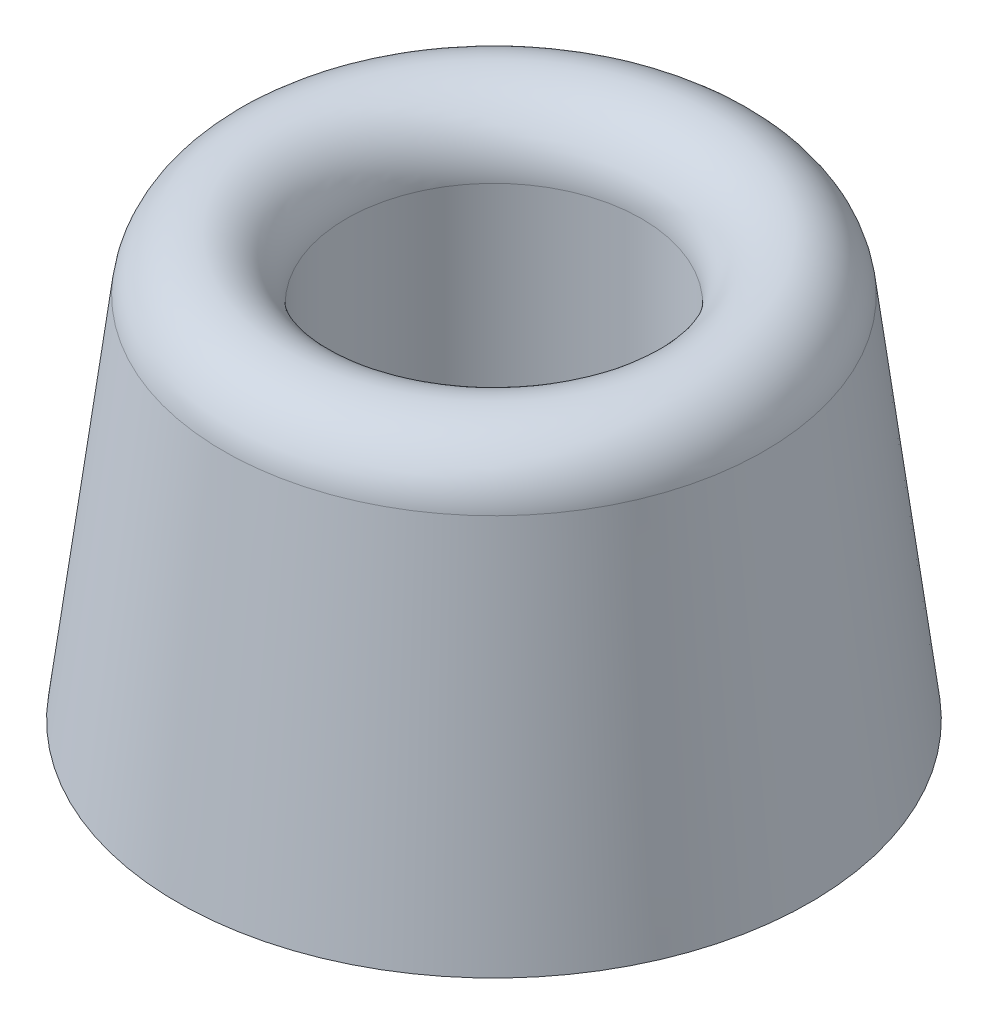
ISO-10303-21;
HEADER;
FILE_DESCRIPTION(('STEP AP214'),'2;1');
FILE_NAME('part.step','',(''),(''),'','','');
FILE_SCHEMA(('AUTOMOTIVE_DESIGN { 1 0 10303 214 1 1 1 1 }'));
ENDSEC;
DATA;
#1=APPLICATION_CONTEXT('core data for automotive mechanical design processes');
#2=APPLICATION_PROTOCOL_DEFINITION('international standard','automotive_design',2000,#1);
#3=PRODUCT_CONTEXT('',#1,'mechanical');
#4=PRODUCT('Part','Part','',(#3));
#5=PRODUCT_RELATED_PRODUCT_CATEGORY('part','',(#4));
#6=PRODUCT_DEFINITION_FORMATION('','',#4);
#7=PRODUCT_DEFINITION_CONTEXT('part definition',#1,'design');
#8=PRODUCT_DEFINITION('design','',#6,#7);
#9=PRODUCT_DEFINITION_SHAPE('','',#8);
#10=(LENGTH_UNIT() NAMED_UNIT(*) SI_UNIT(.MILLI.,.METRE.));
#11=(NAMED_UNIT(*) PLANE_ANGLE_UNIT() SI_UNIT($,.RADIAN.));
#12=(NAMED_UNIT(*) SI_UNIT($,.STERADIAN.) SOLID_ANGLE_UNIT());
#13=UNCERTAINTY_MEASURE_WITH_UNIT(LENGTH_MEASURE(1.E-05),#10,'distance_accuracy_value','');
#14=(GEOMETRIC_REPRESENTATION_CONTEXT(3) GLOBAL_UNCERTAINTY_ASSIGNED_CONTEXT((#13)) GLOBAL_UNIT_ASSIGNED_CONTEXT((#10,
#11,#12)) REPRESENTATION_CONTEXT('',''));
#15=CARTESIAN_POINT('',(0.,0.,0.));
#16=DIRECTION('',(0.,0.,1.));
#17=DIRECTION('',(1.,0.,0.));
#18=AXIS2_PLACEMENT_3D('',#15,#16,#17);
#19=CARTESIAN_POINT('',(0.,13.8438910251235,0.));
#20=DIRECTION('',(0.,-1.,0.));
#21=DIRECTION('',(0.,0.,-1.));
#22=AXIS2_PLACEMENT_3D('',#19,#20,#21);
#23=CONICAL_SURFACE('',#22,10.1757636218596,0.124354994546762);
#24=CARTESIAN_POINT('',(0.,0.,0.));
#25=DIRECTION('',(0.,-1.,0.));
#26=DIRECTION('',(0.,0.,-1.));
#27=AXIS2_PLACEMENT_3D('',#24,#25,#26);
#28=CIRCLE('',#27,11.90625);
#29=CARTESIAN_POINT('',(0.,0.,-11.90625));
#30=VERTEX_POINT('',#29);
#31=EDGE_CURVE('E57',#30,#30,#28,.T.);
#32=ORIENTED_EDGE('',*,*,#31,.F.);
#33=EDGE_LOOP('',(#32));
#34=FACE_BOUND('',#33,.T.);
#35=CARTESIAN_POINT('',(0.,13.8438910251235,0.));
#36=DIRECTION('',(0.,-1.,0.));
#37=DIRECTION('',(0.,0.,-1.));
#38=AXIS2_PLACEMENT_3D('',#35,#36,#37);
#39=CIRCLE('',#38,10.1757636218596);
#40=CARTESIAN_POINT('',(0.,13.8438910251235,-10.1757636218596));
#41=VERTEX_POINT('',#40);
#42=EDGE_CURVE('E10',#41,#41,#39,.T.);
#43=ORIENTED_EDGE('',*,*,#42,.T.);
#44=EDGE_LOOP('',(#43));
#45=FACE_BOUND('',#44,.T.);
#46=ADVANCED_FACE('F35',(#34,#45),#23,.T.);
#47=CARTESIAN_POINT('',(0.,13.5562905087921,0.));
#48=DIRECTION('',(0.,-1.,0.));
#49=DIRECTION('',(0.,0.,-1.));
#50=AXIS2_PLACEMENT_3D('',#47,#48,#49);
#51=TOROIDAL_SURFACE('',#50,7.87495949120793,2.31870949120793);
#52=ORIENTED_EDGE('',*,*,#42,.F.);
#53=EDGE_LOOP('',(#52));
#54=FACE_BOUND('',#53,.T.);
#55=CARTESIAN_POINT('',(0.,13.5562905087921,0.));
#56=DIRECTION('',(0.,-1.,0.));
#57=DIRECTION('',(0.,0.,-1.));
#58=AXIS2_PLACEMENT_3D('',#55,#56,#57);
#59=CIRCLE('',#58,5.55625);
#60=CARTESIAN_POINT('',(0.,13.5562905087921,-5.55625));
#61=VERTEX_POINT('',#60);
#62=EDGE_CURVE('E41',#61,#61,#59,.T.);
#63=ORIENTED_EDGE('',*,*,#62,.T.);
#64=EDGE_LOOP('',(#63));
#65=FACE_BOUND('',#64,.T.);
#66=ADVANCED_FACE('F64',(#54,#65),#51,.T.);
#67=CARTESIAN_POINT('',(0.,0.,0.));
#68=DIRECTION('',(0.,-1.,0.));
#69=DIRECTION('',(0.,0.,-1.));
#70=AXIS2_PLACEMENT_3D('',#67,#68,#69);
#71=CYLINDRICAL_SURFACE('',#70,5.55625);
#72=ORIENTED_EDGE('',*,*,#62,.F.);
#73=EDGE_LOOP('',(#72));
#74=FACE_BOUND('',#73,.T.);
#75=CARTESIAN_POINT('',(0.,4.7625,0.));
#76=DIRECTION('',(0.,-1.,0.));
#77=DIRECTION('',(0.,0.,-1.));
#78=AXIS2_PLACEMENT_3D('',#75,#76,#77);
#79=CIRCLE('',#78,5.55625);
#80=CARTESIAN_POINT('',(0.,4.7625,-5.55625));
#81=VERTEX_POINT('',#80);
#82=EDGE_CURVE('E45',#81,#81,#79,.T.);
#83=ORIENTED_EDGE('',*,*,#82,.T.);
#84=EDGE_LOOP('',(#83));
#85=FACE_BOUND('',#84,.T.);
#86=ADVANCED_FACE('F68',(#74,#85),#71,.F.);
#87=CARTESIAN_POINT('',(-5.55625,4.7625,0.));
#88=DIRECTION('',(0.,-1.,0.));
#89=DIRECTION('',(0.,0.,-1.));
#90=AXIS2_PLACEMENT_3D('',#87,#88,#89);
#91=PLANE('',#90);
#92=ORIENTED_EDGE('',*,*,#82,.F.);
#93=EDGE_LOOP('',(#92));
#94=FACE_BOUND('',#93,.T.);
#95=CARTESIAN_POINT('',(0.,4.7625,0.));
#96=DIRECTION('',(0.,-1.,0.));
#97=DIRECTION('',(0.,0.,-1.));
#98=AXIS2_PLACEMENT_3D('',#95,#96,#97);
#99=CIRCLE('',#98,2.778125);
#100=CARTESIAN_POINT('',(0.,4.7625,-2.778125));
#101=VERTEX_POINT('',#100);
#102=EDGE_CURVE('E49',#101,#101,#99,.T.);
#103=ORIENTED_EDGE('',*,*,#102,.T.);
#104=EDGE_LOOP('',(#103));
#105=FACE_BOUND('',#104,.T.);
#106=ADVANCED_FACE('F73',(#94,#105),#91,.F.);
#107=CARTESIAN_POINT('',(0.,0.,0.));
#108=DIRECTION('',(0.,-1.,0.));
#109=DIRECTION('',(0.,0.,-1.));
#110=AXIS2_PLACEMENT_3D('',#107,#108,#109);
#111=CYLINDRICAL_SURFACE('',#110,2.778125);
#112=ORIENTED_EDGE('',*,*,#102,.F.);
#113=EDGE_LOOP('',(#112));
#114=FACE_BOUND('',#113,.T.);
#115=CARTESIAN_POINT('',(0.,0.,0.));
#116=DIRECTION('',(0.,-1.,0.));
#117=DIRECTION('',(0.,0.,-1.));
#118=AXIS2_PLACEMENT_3D('',#115,#116,#117);
#119=CIRCLE('',#118,2.778125);
#120=CARTESIAN_POINT('',(0.,0.,-2.778125));
#121=VERTEX_POINT('',#120);
#122=EDGE_CURVE('E54',#121,#121,#119,.T.);
#123=ORIENTED_EDGE('',*,*,#122,.T.);
#124=EDGE_LOOP('',(#123));
#125=FACE_BOUND('',#124,.T.);
#126=ADVANCED_FACE('F79',(#114,#125),#111,.F.);
#127=CARTESIAN_POINT('',(-2.778125,0.,0.));
#128=DIRECTION('',(0.,1.,0.));
#129=DIRECTION('',(0.,0.,1.));
#130=AXIS2_PLACEMENT_3D('',#127,#128,#129);
#131=PLANE('',#130);
#132=ORIENTED_EDGE('',*,*,#122,.F.);
#133=EDGE_LOOP('',(#132));
#134=FACE_BOUND('',#133,.T.);
#135=ORIENTED_EDGE('',*,*,#31,.T.);
#136=EDGE_LOOP('',(#135));
#137=FACE_BOUND('',#136,.T.);
#138=ADVANCED_FACE('F61',(#134,#137),#131,.F.);
#139=CLOSED_SHELL('',(#46,#66,#86,#106,#126,#138));
#140=MANIFOLD_SOLID_BREP('B2',#139);
#141=ADVANCED_BREP_SHAPE_REPRESENTATION('',(#18,#140),#14);
#142=SHAPE_DEFINITION_REPRESENTATION(#9,#141);
ENDSEC;
END-ISO-10303-21;
